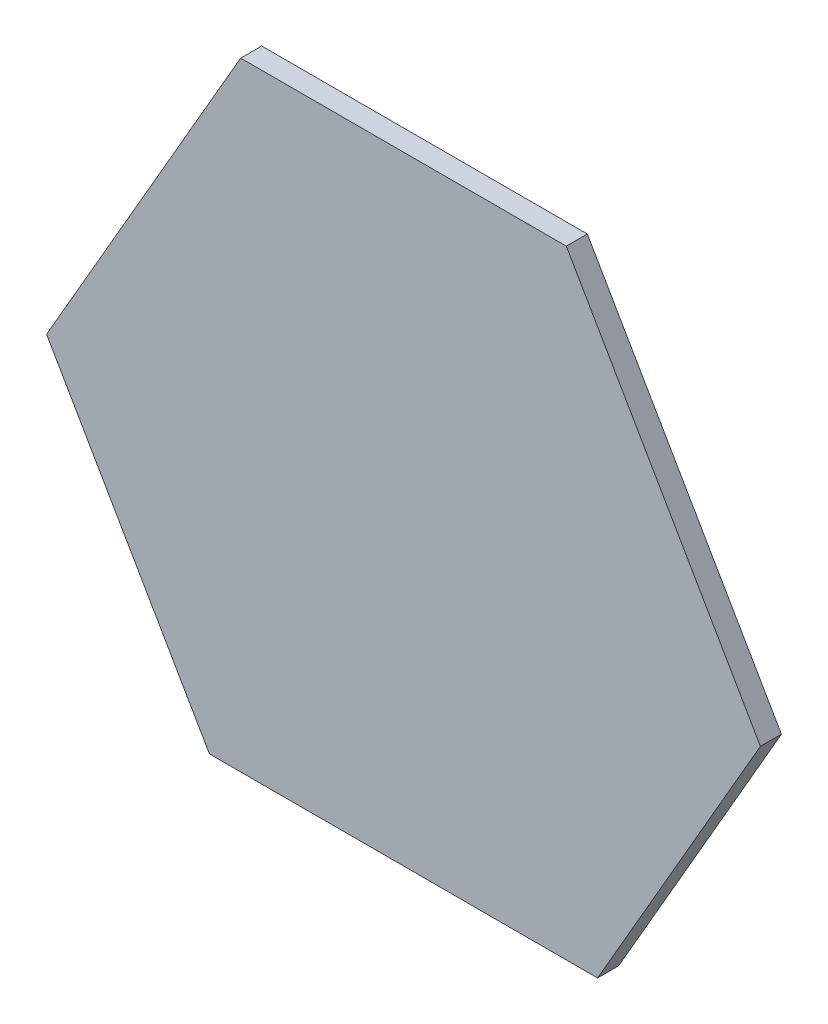
ISO-10303-21;
HEADER;
FILE_DESCRIPTION(('STEP AP214'),'2;1');
FILE_NAME('part.step','',(''),(''),'','','');
FILE_SCHEMA(('AUTOMOTIVE_DESIGN { 1 0 10303 214 1 1 1 1 }'));
ENDSEC;
DATA;
#1=APPLICATION_CONTEXT('core data for automotive mechanical design processes');
#2=APPLICATION_PROTOCOL_DEFINITION('international standard','automotive_design',2000,#1);
#3=PRODUCT_CONTEXT('',#1,'mechanical');
#4=PRODUCT('Part','Part','',(#3));
#5=PRODUCT_RELATED_PRODUCT_CATEGORY('part','',(#4));
#6=PRODUCT_DEFINITION_FORMATION('','',#4);
#7=PRODUCT_DEFINITION_CONTEXT('part definition',#1,'design');
#8=PRODUCT_DEFINITION('design','',#6,#7);
#9=PRODUCT_DEFINITION_SHAPE('','',#8);
#10=(LENGTH_UNIT() NAMED_UNIT(*) SI_UNIT(.MILLI.,.METRE.));
#11=(NAMED_UNIT(*) PLANE_ANGLE_UNIT() SI_UNIT($,.RADIAN.));
#12=(NAMED_UNIT(*) SI_UNIT($,.STERADIAN.) SOLID_ANGLE_UNIT());
#13=UNCERTAINTY_MEASURE_WITH_UNIT(LENGTH_MEASURE(1.E-05),#10,'distance_accuracy_value','');
#14=(GEOMETRIC_REPRESENTATION_CONTEXT(3) GLOBAL_UNCERTAINTY_ASSIGNED_CONTEXT((#13)) GLOBAL_UNIT_ASSIGNED_CONTEXT((#10,
#11,#12)) REPRESENTATION_CONTEXT('',''));
#15=CARTESIAN_POINT('',(0.,0.,0.));
#16=DIRECTION('',(0.,0.,1.));
#17=DIRECTION('',(1.,0.,0.));
#18=AXIS2_PLACEMENT_3D('',#15,#16,#17);
#19=CARTESIAN_POINT('',(-107.871287349666,-5.4538165441722,6.35));
#20=DIRECTION('',(0.866025403784439,-0.5,0.));
#21=DIRECTION('',(0.5,0.866025403784439,0.));
#22=AXIS2_PLACEMENT_3D('',#19,#20,#21);
#23=PLANE('',#22);
#24=DIRECTION('',(-0.5,-0.866025403784439,0.));
#25=VECTOR('',#24,1.);
#26=CARTESIAN_POINT('',(-107.871287349666,-5.4538165441722,0.));
#27=LINE('',#26,#25);
#28=CARTESIAN_POINT('',(-49.2125,96.1461834558278,0.));
#29=VERTEX_POINT('',#28);
#30=CARTESIAN_POINT('',(-107.871287349666,-5.4538165441722,0.));
#31=VERTEX_POINT('',#30);
#32=EDGE_CURVE('E131',#29,#31,#27,.T.);
#33=ORIENTED_EDGE('',*,*,#32,.T.);
#34=DIRECTION('',(0.,0.,-1.));
#35=VECTOR('',#34,1.);
#36=CARTESIAN_POINT('',(-107.871287349666,-5.4538165441722,6.35));
#37=LINE('',#36,#35);
#38=CARTESIAN_POINT('',(-107.871287349666,-5.4538165441722,6.35));
#39=VERTEX_POINT('',#38);
#40=EDGE_CURVE('E11',#39,#31,#37,.T.);
#41=ORIENTED_EDGE('',*,*,#40,.F.);
#42=DIRECTION('',(-0.5,-0.866025403784439,0.));
#43=VECTOR('',#42,1.);
#44=CARTESIAN_POINT('',(-107.871287349666,-5.4538165441722,6.35));
#45=LINE('',#44,#43);
#46=CARTESIAN_POINT('',(-49.2125,96.1461834558278,6.35));
#47=VERTEX_POINT('',#46);
#48=EDGE_CURVE('E144',#47,#39,#45,.T.);
#49=ORIENTED_EDGE('',*,*,#48,.F.);
#50=DIRECTION('',(0.,0.,-1.));
#51=VECTOR('',#50,1.);
#52=CARTESIAN_POINT('',(-49.2125,96.1461834558278,6.35));
#53=LINE('',#52,#51);
#54=EDGE_CURVE('E127',#47,#29,#53,.T.);
#55=ORIENTED_EDGE('',*,*,#54,.T.);
#56=EDGE_LOOP('',(#33,#41,#49,#55));
#57=FACE_BOUND('',#56,.T.);
#58=ADVANCED_FACE('F44',(#57),#23,.F.);
#59=CARTESIAN_POINT('',(-58.658787349666,-90.6923669116556,6.35));
#60=DIRECTION('',(0.866025403784439,0.5,0.));
#61=DIRECTION('',(-0.5,0.866025403784439,0.));
#62=AXIS2_PLACEMENT_3D('',#59,#60,#61);
#63=PLANE('',#62);
#64=DIRECTION('',(0.5,-0.866025403784439,0.));
#65=VECTOR('',#64,1.);
#66=CARTESIAN_POINT('',(-58.658787349666,-90.6923669116556,0.));
#67=LINE('',#66,#65);
#68=CARTESIAN_POINT('',(-58.658787349666,-90.6923669116556,0.));
#69=VERTEX_POINT('',#68);
#70=EDGE_CURVE('E135',#31,#69,#67,.T.);
#71=ORIENTED_EDGE('',*,*,#70,.T.);
#72=DIRECTION('',(0.,0.,-1.));
#73=VECTOR('',#72,1.);
#74=CARTESIAN_POINT('',(-58.658787349666,-90.6923669116556,6.35));
#75=LINE('',#74,#73);
#76=CARTESIAN_POINT('',(-58.658787349666,-90.6923669116556,6.35));
#77=VERTEX_POINT('',#76);
#78=EDGE_CURVE('E52',#77,#69,#75,.T.);
#79=ORIENTED_EDGE('',*,*,#78,.F.);
#80=DIRECTION('',(0.5,-0.866025403784439,0.));
#81=VECTOR('',#80,1.);
#82=CARTESIAN_POINT('',(-58.658787349666,-90.6923669116556,6.35));
#83=LINE('',#82,#81);
#84=EDGE_CURVE('E98',#39,#77,#83,.T.);
#85=ORIENTED_EDGE('',*,*,#84,.F.);
#86=ORIENTED_EDGE('',*,*,#40,.T.);
#87=EDGE_LOOP('',(#71,#79,#85,#86));
#88=FACE_BOUND('',#87,.T.);
#89=ADVANCED_FACE('F169',(#88),#63,.F.);
#90=CARTESIAN_POINT('',(58.658787349666,-90.6923669116556,6.35));
#91=DIRECTION('',(0.,1.,0.));
#92=DIRECTION('',(0.,0.,1.));
#93=AXIS2_PLACEMENT_3D('',#90,#91,#92);
#94=PLANE('',#93);
#95=DIRECTION('',(1.,0.,0.));
#96=VECTOR('',#95,1.);
#97=CARTESIAN_POINT('',(58.658787349666,-90.6923669116556,0.));
#98=LINE('',#97,#96);
#99=CARTESIAN_POINT('',(58.658787349666,-90.6923669116556,0.));
#100=VERTEX_POINT('',#99);
#101=EDGE_CURVE('E137',#69,#100,#98,.T.);
#102=ORIENTED_EDGE('',*,*,#101,.T.);
#103=DIRECTION('',(0.,0.,-1.));
#104=VECTOR('',#103,1.);
#105=CARTESIAN_POINT('',(58.658787349666,-90.6923669116556,6.35));
#106=LINE('',#105,#104);
#107=CARTESIAN_POINT('',(58.658787349666,-90.6923669116556,6.35));
#108=VERTEX_POINT('',#107);
#109=EDGE_CURVE('E122',#108,#100,#106,.T.);
#110=ORIENTED_EDGE('',*,*,#109,.F.);
#111=DIRECTION('',(1.,0.,0.));
#112=VECTOR('',#111,1.);
#113=CARTESIAN_POINT('',(58.658787349666,-90.6923669116556,6.35));
#114=LINE('',#113,#112);
#115=EDGE_CURVE('E112',#77,#108,#114,.T.);
#116=ORIENTED_EDGE('',*,*,#115,.F.);
#117=ORIENTED_EDGE('',*,*,#78,.T.);
#118=EDGE_LOOP('',(#102,#110,#116,#117));
#119=FACE_BOUND('',#118,.T.);
#120=ADVANCED_FACE('F151',(#119),#94,.F.);
#121=CARTESIAN_POINT('',(107.871287349666,-5.45381654417219,6.35));
#122=DIRECTION('',(-0.866025403784439,0.5,0.));
#123=DIRECTION('',(-0.5,-0.866025403784439,0.));
#124=AXIS2_PLACEMENT_3D('',#121,#122,#123);
#125=PLANE('',#124);
#126=DIRECTION('',(0.5,0.866025403784439,0.));
#127=VECTOR('',#126,1.);
#128=CARTESIAN_POINT('',(107.871287349666,-5.45381654417219,0.));
#129=LINE('',#128,#127);
#130=CARTESIAN_POINT('',(107.871287349666,-5.45381654417219,0.));
#131=VERTEX_POINT('',#130);
#132=EDGE_CURVE('E121',#100,#131,#129,.T.);
#133=ORIENTED_EDGE('',*,*,#132,.T.);
#134=DIRECTION('',(0.,0.,-1.));
#135=VECTOR('',#134,1.);
#136=CARTESIAN_POINT('',(107.871287349666,-5.45381654417219,6.35));
#137=LINE('',#136,#135);
#138=CARTESIAN_POINT('',(107.871287349666,-5.45381654417219,6.35));
#139=VERTEX_POINT('',#138);
#140=EDGE_CURVE('E118',#139,#131,#137,.T.);
#141=ORIENTED_EDGE('',*,*,#140,.F.);
#142=DIRECTION('',(0.5,0.866025403784439,0.));
#143=VECTOR('',#142,1.);
#144=CARTESIAN_POINT('',(107.871287349666,-5.45381654417219,6.35));
#145=LINE('',#144,#143);
#146=EDGE_CURVE('E106',#108,#139,#145,.T.);
#147=ORIENTED_EDGE('',*,*,#146,.F.);
#148=ORIENTED_EDGE('',*,*,#109,.T.);
#149=EDGE_LOOP('',(#133,#141,#147,#148));
#150=FACE_BOUND('',#149,.T.);
#151=ADVANCED_FACE('F119',(#150),#125,.F.);
#152=CARTESIAN_POINT('',(49.2125,96.1461834558278,6.35));
#153=DIRECTION('',(-0.866025403784439,-0.5,0.));
#154=DIRECTION('',(0.5,-0.866025403784439,0.));
#155=AXIS2_PLACEMENT_3D('',#152,#153,#154);
#156=PLANE('',#155);
#157=DIRECTION('',(-0.5,0.866025403784439,0.));
#158=VECTOR('',#157,1.);
#159=CARTESIAN_POINT('',(49.2125,96.1461834558278,0.));
#160=LINE('',#159,#158);
#161=CARTESIAN_POINT('',(49.2125,96.1461834558278,0.));
#162=VERTEX_POINT('',#161);
#163=EDGE_CURVE('E84',#131,#162,#160,.T.);
#164=ORIENTED_EDGE('',*,*,#163,.T.);
#165=DIRECTION('',(0.,0.,-1.));
#166=VECTOR('',#165,1.);
#167=CARTESIAN_POINT('',(49.2125,96.1461834558278,6.35));
#168=LINE('',#167,#166);
#169=CARTESIAN_POINT('',(49.2125,96.1461834558278,6.35));
#170=VERTEX_POINT('',#169);
#171=EDGE_CURVE('E123',#170,#162,#168,.T.);
#172=ORIENTED_EDGE('',*,*,#171,.F.);
#173=DIRECTION('',(-0.5,0.866025403784439,0.));
#174=VECTOR('',#173,1.);
#175=CARTESIAN_POINT('',(49.2125,96.1461834558278,6.35));
#176=LINE('',#175,#174);
#177=EDGE_CURVE('E110',#139,#170,#176,.T.);
#178=ORIENTED_EDGE('',*,*,#177,.F.);
#179=ORIENTED_EDGE('',*,*,#140,.T.);
#180=EDGE_LOOP('',(#164,#172,#178,#179));
#181=FACE_BOUND('',#180,.T.);
#182=ADVANCED_FACE('F125',(#181),#156,.F.);
#183=CARTESIAN_POINT('',(-49.2125,96.1461834558278,6.35));
#184=DIRECTION('',(0.,-1.,0.));
#185=DIRECTION('',(0.,0.,-1.));
#186=AXIS2_PLACEMENT_3D('',#183,#184,#185);
#187=PLANE('',#186);
#188=DIRECTION('',(-1.,0.,0.));
#189=VECTOR('',#188,1.);
#190=CARTESIAN_POINT('',(-49.2125,96.1461834558278,0.));
#191=LINE('',#190,#189);
#192=EDGE_CURVE('E90',#162,#29,#191,.T.);
#193=ORIENTED_EDGE('',*,*,#192,.T.);
#194=ORIENTED_EDGE('',*,*,#54,.F.);
#195=DIRECTION('',(-1.,0.,0.));
#196=VECTOR('',#195,1.);
#197=CARTESIAN_POINT('',(-49.2125,96.1461834558278,6.35));
#198=LINE('',#197,#196);
#199=EDGE_CURVE('E60',#170,#47,#198,.T.);
#200=ORIENTED_EDGE('',*,*,#199,.F.);
#201=ORIENTED_EDGE('',*,*,#171,.T.);
#202=EDGE_LOOP('',(#193,#194,#200,#201));
#203=FACE_BOUND('',#202,.T.);
#204=ADVANCED_FACE('F158',(#203),#187,.F.);
#205=CARTESIAN_POINT('',(0.,0.,6.35));
#206=DIRECTION('',(0.,0.,-1.));
#207=DIRECTION('',(-1.,0.,0.));
#208=AXIS2_PLACEMENT_3D('',#205,#206,#207);
#209=PLANE('',#208);
#210=ORIENTED_EDGE('',*,*,#48,.T.);
#211=ORIENTED_EDGE('',*,*,#84,.T.);
#212=ORIENTED_EDGE('',*,*,#115,.T.);
#213=ORIENTED_EDGE('',*,*,#146,.T.);
#214=ORIENTED_EDGE('',*,*,#177,.T.);
#215=ORIENTED_EDGE('',*,*,#199,.T.);
#216=EDGE_LOOP('',(#210,#211,#212,#213,#214,#215));
#217=FACE_BOUND('',#216,.T.);
#218=ADVANCED_FACE('F108',(#217),#209,.F.);
#219=CARTESIAN_POINT('',(0.,0.,0.));
#220=DIRECTION('',(0.,0.,-1.));
#221=DIRECTION('',(-1.,0.,0.));
#222=AXIS2_PLACEMENT_3D('',#219,#220,#221);
#223=PLANE('',#222);
#224=ORIENTED_EDGE('',*,*,#32,.F.);
#225=ORIENTED_EDGE('',*,*,#192,.F.);
#226=ORIENTED_EDGE('',*,*,#163,.F.);
#227=ORIENTED_EDGE('',*,*,#132,.F.);
#228=ORIENTED_EDGE('',*,*,#101,.F.);
#229=ORIENTED_EDGE('',*,*,#70,.F.);
#230=EDGE_LOOP('',(#224,#225,#226,#227,#228,#229));
#231=FACE_BOUND('',#230,.T.);
#232=ADVANCED_FACE('F154',(#231),#223,.T.);
#233=CLOSED_SHELL('',(#58,#89,#120,#151,#182,#204,#218,#232));
#234=MANIFOLD_SOLID_BREP('B2',#233);
#235=ADVANCED_BREP_SHAPE_REPRESENTATION('',(#18,#234),#14);
#236=SHAPE_DEFINITION_REPRESENTATION(#9,#235);
ENDSEC;
END-ISO-10303-21;
